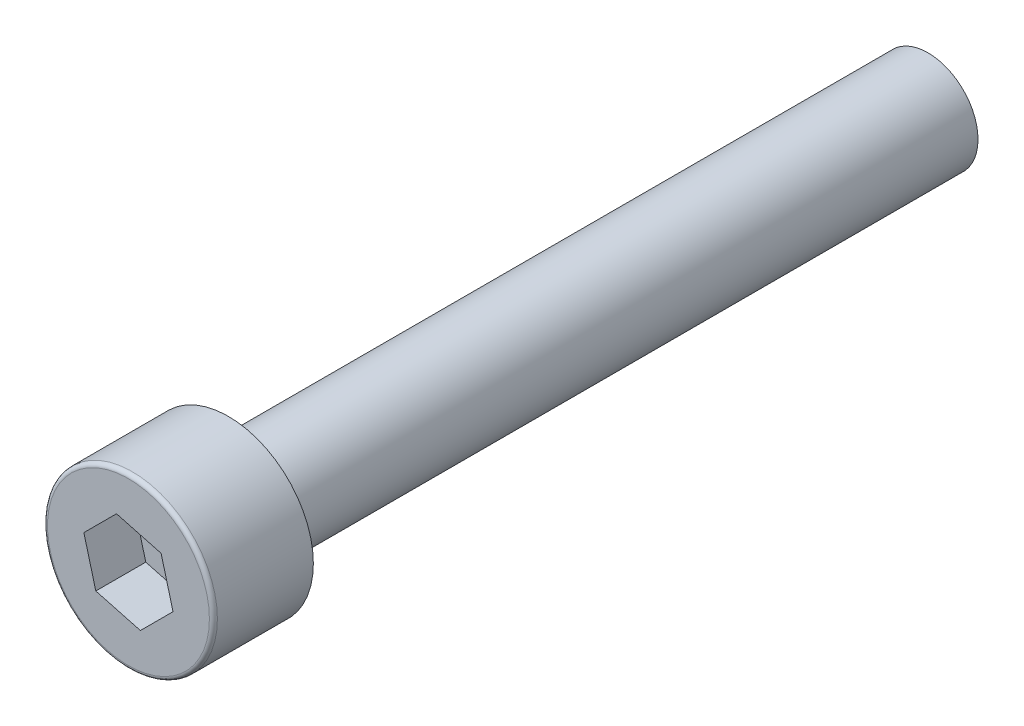
ISO-10303-21;
HEADER;
FILE_DESCRIPTION(('STEP AP214'),'2;1');
FILE_NAME('part.step','',(''),(''),'','','');
FILE_SCHEMA(('AUTOMOTIVE_DESIGN { 1 0 10303 214 1 1 1 1 }'));
ENDSEC;
DATA;
#1=APPLICATION_CONTEXT('core data for automotive mechanical design processes');
#2=APPLICATION_PROTOCOL_DEFINITION('international standard','automotive_design',2000,#1);
#3=PRODUCT_CONTEXT('',#1,'mechanical');
#4=PRODUCT('Part','Part','',(#3));
#5=PRODUCT_RELATED_PRODUCT_CATEGORY('part','',(#4));
#6=PRODUCT_DEFINITION_FORMATION('','',#4);
#7=PRODUCT_DEFINITION_CONTEXT('part definition',#1,'design');
#8=PRODUCT_DEFINITION('design','',#6,#7);
#9=PRODUCT_DEFINITION_SHAPE('','',#8);
#10=(LENGTH_UNIT() NAMED_UNIT(*) SI_UNIT(.MILLI.,.METRE.));
#11=(NAMED_UNIT(*) PLANE_ANGLE_UNIT() SI_UNIT($,.RADIAN.));
#12=(NAMED_UNIT(*) SI_UNIT($,.STERADIAN.) SOLID_ANGLE_UNIT());
#13=UNCERTAINTY_MEASURE_WITH_UNIT(LENGTH_MEASURE(1.E-05),#10,'distance_accuracy_value','');
#14=(GEOMETRIC_REPRESENTATION_CONTEXT(3) GLOBAL_UNCERTAINTY_ASSIGNED_CONTEXT((#13)) GLOBAL_UNIT_ASSIGNED_CONTEXT((#10,
#11,#12)) REPRESENTATION_CONTEXT('',''));
#15=CARTESIAN_POINT('',(0.,0.,0.));
#16=DIRECTION('',(0.,0.,1.));
#17=DIRECTION('',(1.,0.,0.));
#18=AXIS2_PLACEMENT_3D('',#15,#16,#17);
#19=CARTESIAN_POINT('',(0.,0.,0.));
#20=DIRECTION('',(0.,0.,1.));
#21=DIRECTION('',(1.,0.,0.));
#22=AXIS2_PLACEMENT_3D('',#19,#20,#21);
#23=PLANE('',#22);
#24=CARTESIAN_POINT('',(0.,0.,0.));
#25=DIRECTION('',(0.,0.,1.));
#26=DIRECTION('',(1.,0.,0.));
#27=AXIS2_PLACEMENT_3D('',#24,#25,#26);
#28=CIRCLE('',#27,4.25);
#29=CARTESIAN_POINT('',(4.25,0.,0.));
#30=VERTEX_POINT('',#29);
#31=EDGE_CURVE('E137',#30,#30,#28,.T.);
#32=ORIENTED_EDGE('',*,*,#31,.F.);
#33=EDGE_LOOP('',(#32));
#34=FACE_BOUND('',#33,.T.);
#35=CARTESIAN_POINT('',(0.,0.,0.));
#36=DIRECTION('',(0.,0.,1.));
#37=DIRECTION('',(1.,0.,0.));
#38=AXIS2_PLACEMENT_3D('',#35,#36,#37);
#39=CIRCLE('',#38,2.5);
#40=CARTESIAN_POINT('',(2.5,0.,0.));
#41=VERTEX_POINT('',#40);
#42=EDGE_CURVE('E145',#41,#41,#39,.F.);
#43=ORIENTED_EDGE('',*,*,#42,.F.);
#44=EDGE_LOOP('',(#43));
#45=FACE_BOUND('',#44,.T.);
#46=ADVANCED_FACE('F34',(#34,#45),#23,.F.);
#47=CARTESIAN_POINT('',(0.,0.,5.));
#48=DIRECTION('',(0.,0.,-1.));
#49=DIRECTION('',(-1.,0.,0.));
#50=AXIS2_PLACEMENT_3D('',#47,#48,#49);
#51=CYLINDRICAL_SURFACE('',#50,4.25);
#52=CARTESIAN_POINT('',(0.,0.,4.8));
#53=DIRECTION('',(0.,0.,1.));
#54=DIRECTION('',(1.,0.,0.));
#55=AXIS2_PLACEMENT_3D('',#52,#53,#54);
#56=CIRCLE('',#55,4.25);
#57=CARTESIAN_POINT('',(4.25,0.,4.8));
#58=VERTEX_POINT('',#57);
#59=EDGE_CURVE('E11',#58,#58,#56,.F.);
#60=ORIENTED_EDGE('',*,*,#59,.T.);
#61=EDGE_LOOP('',(#60));
#62=FACE_BOUND('',#61,.T.);
#63=ORIENTED_EDGE('',*,*,#31,.T.);
#64=EDGE_LOOP('',(#63));
#65=FACE_BOUND('',#64,.T.);
#66=ADVANCED_FACE('F164',(#62,#65),#51,.T.);
#67=CARTESIAN_POINT('',(0.,0.,5.));
#68=DIRECTION('',(0.,0.,1.));
#69=DIRECTION('',(1.,0.,0.));
#70=AXIS2_PLACEMENT_3D('',#67,#68,#69);
#71=PLANE('',#70);
#72=CARTESIAN_POINT('',(0.,0.,5.));
#73=DIRECTION('',(0.,0.,1.));
#74=DIRECTION('',(1.,0.,0.));
#75=AXIS2_PLACEMENT_3D('',#72,#73,#74);
#76=CIRCLE('',#75,4.05);
#77=CARTESIAN_POINT('',(4.05,0.,5.));
#78=VERTEX_POINT('',#77);
#79=EDGE_CURVE('E42',#78,#78,#76,.T.);
#80=ORIENTED_EDGE('',*,*,#79,.T.);
#81=EDGE_LOOP('',(#80));
#82=FACE_BOUND('',#81,.T.);
#83=DIRECTION('',(0.258819045102521,-0.965925826289068,0.));
#84=VECTOR('',#83,1.);
#85=CARTESIAN_POINT('',(-2.23071014330082,0.597716981445369,5.));
#86=LINE('',#85,#84);
#87=CARTESIAN_POINT('',(-2.23071014330082,0.597716981445369,5.));
#88=VERTEX_POINT('',#87);
#89=CARTESIAN_POINT('',(-1.63299316185545,-1.63299316185545,5.));
#90=VERTEX_POINT('',#89);
#91=EDGE_CURVE('E49',#88,#90,#86,.T.);
#92=ORIENTED_EDGE('',*,*,#91,.F.);
#93=DIRECTION('',(-0.707106781186547,-0.707106781186548,0.));
#94=VECTOR('',#93,1.);
#95=CARTESIAN_POINT('',(-0.597716981445369,2.23071014330082,5.));
#96=LINE('',#95,#94);
#97=CARTESIAN_POINT('',(-0.597716981445369,2.23071014330082,5.));
#98=VERTEX_POINT('',#97);
#99=EDGE_CURVE('E133',#98,#88,#96,.T.);
#100=ORIENTED_EDGE('',*,*,#99,.F.);
#101=DIRECTION('',(-0.965925826289068,0.258819045102521,0.));
#102=VECTOR('',#101,1.);
#103=CARTESIAN_POINT('',(1.63299316185545,1.63299316185545,5.));
#104=LINE('',#103,#102);
#105=CARTESIAN_POINT('',(1.63299316185545,1.63299316185545,5.));
#106=VERTEX_POINT('',#105);
#107=EDGE_CURVE('E131',#106,#98,#104,.T.);
#108=ORIENTED_EDGE('',*,*,#107,.F.);
#109=DIRECTION('',(-0.258819045102521,0.965925826289068,0.));
#110=VECTOR('',#109,1.);
#111=CARTESIAN_POINT('',(2.23071014330082,-0.597716981445369,5.));
#112=LINE('',#111,#110);
#113=CARTESIAN_POINT('',(2.23071014330082,-0.597716981445369,5.));
#114=VERTEX_POINT('',#113);
#115=EDGE_CURVE('E97',#114,#106,#112,.T.);
#116=ORIENTED_EDGE('',*,*,#115,.F.);
#117=DIRECTION('',(0.707106781186547,0.707106781186547,0.));
#118=VECTOR('',#117,1.);
#119=CARTESIAN_POINT('',(0.597716981445369,-2.23071014330082,5.));
#120=LINE('',#119,#118);
#121=CARTESIAN_POINT('',(0.597716981445369,-2.23071014330082,5.));
#122=VERTEX_POINT('',#121);
#123=EDGE_CURVE('E127',#122,#114,#120,.T.);
#124=ORIENTED_EDGE('',*,*,#123,.F.);
#125=DIRECTION('',(0.965925826289068,-0.258819045102521,0.));
#126=VECTOR('',#125,1.);
#127=CARTESIAN_POINT('',(-1.63299316185545,-1.63299316185545,5.));
#128=LINE('',#127,#126);
#129=EDGE_CURVE('E123',#90,#122,#128,.T.);
#130=ORIENTED_EDGE('',*,*,#129,.F.);
#131=EDGE_LOOP('',(#92,#100,#108,#116,#124,#130));
#132=FACE_BOUND('',#131,.T.);
#133=ADVANCED_FACE('F150',(#82,#132),#71,.T.);
#134=CARTESIAN_POINT('',(-2.23071014330082,0.597716981445369,2.5));
#135=DIRECTION('',(-0.965925826289068,-0.258819045102521,0.));
#136=DIRECTION('',(0.258819045102521,-0.965925826289068,0.));
#137=AXIS2_PLACEMENT_3D('',#134,#135,#136);
#138=PLANE('',#137);
#139=ORIENTED_EDGE('',*,*,#91,.T.);
#140=DIRECTION('',(0.,0.,1.));
#141=VECTOR('',#140,1.);
#142=CARTESIAN_POINT('',(-1.63299316185545,-1.63299316185545,2.5));
#143=LINE('',#142,#141);
#144=CARTESIAN_POINT('',(-1.63299316185545,-1.63299316185545,2.5));
#145=VERTEX_POINT('',#144);
#146=EDGE_CURVE('E79',#145,#90,#143,.T.);
#147=ORIENTED_EDGE('',*,*,#146,.F.);
#148=DIRECTION('',(0.258819045102521,-0.965925826289068,0.));
#149=VECTOR('',#148,1.);
#150=CARTESIAN_POINT('',(-2.23071014330082,0.597716981445369,2.5));
#151=LINE('',#150,#149);
#152=CARTESIAN_POINT('',(-2.23071014330082,0.597716981445369,2.5));
#153=VERTEX_POINT('',#152);
#154=EDGE_CURVE('E135',#153,#145,#151,.T.);
#155=ORIENTED_EDGE('',*,*,#154,.F.);
#156=DIRECTION('',(0.,0.,1.));
#157=VECTOR('',#156,1.);
#158=CARTESIAN_POINT('',(-2.23071014330082,0.597716981445369,2.5));
#159=LINE('',#158,#157);
#160=EDGE_CURVE('E57',#153,#88,#159,.T.);
#161=ORIENTED_EDGE('',*,*,#160,.T.);
#162=EDGE_LOOP('',(#139,#147,#155,#161));
#163=FACE_BOUND('',#162,.T.);
#164=ADVANCED_FACE('F176',(#163),#138,.F.);
#165=CARTESIAN_POINT('',(-0.597716981445369,2.23071014330082,2.5));
#166=DIRECTION('',(-0.707106781186548,0.707106781186547,0.));
#167=DIRECTION('',(-0.707106781186547,-0.707106781186548,0.));
#168=AXIS2_PLACEMENT_3D('',#165,#166,#167);
#169=PLANE('',#168);
#170=ORIENTED_EDGE('',*,*,#99,.T.);
#171=ORIENTED_EDGE('',*,*,#160,.F.);
#172=DIRECTION('',(-0.707106781186547,-0.707106781186548,0.));
#173=VECTOR('',#172,1.);
#174=CARTESIAN_POINT('',(-0.597716981445369,2.23071014330082,2.5));
#175=LINE('',#174,#173);
#176=CARTESIAN_POINT('',(-0.597716981445369,2.23071014330082,2.5));
#177=VERTEX_POINT('',#176);
#178=EDGE_CURVE('E109',#177,#153,#175,.T.);
#179=ORIENTED_EDGE('',*,*,#178,.F.);
#180=DIRECTION('',(0.,0.,1.));
#181=VECTOR('',#180,1.);
#182=CARTESIAN_POINT('',(-0.597716981445369,2.23071014330082,2.5));
#183=LINE('',#182,#181);
#184=EDGE_CURVE('E101',#177,#98,#183,.T.);
#185=ORIENTED_EDGE('',*,*,#184,.T.);
#186=EDGE_LOOP('',(#170,#171,#179,#185));
#187=FACE_BOUND('',#186,.T.);
#188=ADVANCED_FACE('F179',(#187),#169,.F.);
#189=CARTESIAN_POINT('',(1.63299316185545,1.63299316185545,2.5));
#190=DIRECTION('',(0.258819045102521,0.965925826289068,0.));
#191=DIRECTION('',(-0.965925826289068,0.258819045102521,0.));
#192=AXIS2_PLACEMENT_3D('',#189,#190,#191);
#193=PLANE('',#192);
#194=ORIENTED_EDGE('',*,*,#107,.T.);
#195=ORIENTED_EDGE('',*,*,#184,.F.);
#196=DIRECTION('',(-0.965925826289068,0.258819045102521,0.));
#197=VECTOR('',#196,1.);
#198=CARTESIAN_POINT('',(1.63299316185545,1.63299316185545,2.5));
#199=LINE('',#198,#197);
#200=CARTESIAN_POINT('',(1.63299316185545,1.63299316185545,2.5));
#201=VERTEX_POINT('',#200);
#202=EDGE_CURVE('E105',#201,#177,#199,.T.);
#203=ORIENTED_EDGE('',*,*,#202,.F.);
#204=DIRECTION('',(0.,0.,1.));
#205=VECTOR('',#204,1.);
#206=CARTESIAN_POINT('',(1.63299316185545,1.63299316185545,2.5));
#207=LINE('',#206,#205);
#208=EDGE_CURVE('E90',#201,#106,#207,.T.);
#209=ORIENTED_EDGE('',*,*,#208,.T.);
#210=EDGE_LOOP('',(#194,#195,#203,#209));
#211=FACE_BOUND('',#210,.T.);
#212=ADVANCED_FACE('F106',(#211),#193,.F.);
#213=CARTESIAN_POINT('',(2.23071014330082,-0.597716981445369,2.5));
#214=DIRECTION('',(0.965925826289068,0.258819045102521,0.));
#215=DIRECTION('',(-0.258819045102521,0.965925826289068,0.));
#216=AXIS2_PLACEMENT_3D('',#213,#214,#215);
#217=PLANE('',#216);
#218=ORIENTED_EDGE('',*,*,#115,.T.);
#219=ORIENTED_EDGE('',*,*,#208,.F.);
#220=DIRECTION('',(-0.258819045102521,0.965925826289068,0.));
#221=VECTOR('',#220,1.);
#222=CARTESIAN_POINT('',(2.23071014330082,-0.597716981445369,2.5));
#223=LINE('',#222,#221);
#224=CARTESIAN_POINT('',(2.23071014330082,-0.597716981445369,2.5));
#225=VERTEX_POINT('',#224);
#226=EDGE_CURVE('E94',#225,#201,#223,.T.);
#227=ORIENTED_EDGE('',*,*,#226,.F.);
#228=DIRECTION('',(0.,0.,1.));
#229=VECTOR('',#228,1.);
#230=CARTESIAN_POINT('',(2.23071014330082,-0.597716981445369,2.5));
#231=LINE('',#230,#229);
#232=EDGE_CURVE('E102',#225,#114,#231,.T.);
#233=ORIENTED_EDGE('',*,*,#232,.T.);
#234=EDGE_LOOP('',(#218,#219,#227,#233));
#235=FACE_BOUND('',#234,.T.);
#236=ADVANCED_FACE('F92',(#235),#217,.F.);
#237=CARTESIAN_POINT('',(0.597716981445369,-2.23071014330082,2.5));
#238=DIRECTION('',(0.707106781186548,-0.707106781186548,0.));
#239=DIRECTION('',(0.707106781186548,0.707106781186548,0.));
#240=AXIS2_PLACEMENT_3D('',#237,#238,#239);
#241=PLANE('',#240);
#242=ORIENTED_EDGE('',*,*,#123,.T.);
#243=ORIENTED_EDGE('',*,*,#232,.F.);
#244=DIRECTION('',(0.707106781186547,0.707106781186547,0.));
#245=VECTOR('',#244,1.);
#246=CARTESIAN_POINT('',(0.597716981445369,-2.23071014330082,2.5));
#247=LINE('',#246,#245);
#248=CARTESIAN_POINT('',(0.597716981445369,-2.23071014330082,2.5));
#249=VERTEX_POINT('',#248);
#250=EDGE_CURVE('E115',#249,#225,#247,.T.);
#251=ORIENTED_EDGE('',*,*,#250,.F.);
#252=DIRECTION('',(0.,0.,1.));
#253=VECTOR('',#252,1.);
#254=CARTESIAN_POINT('',(0.597716981445369,-2.23071014330082,2.5));
#255=LINE('',#254,#253);
#256=EDGE_CURVE('E140',#249,#122,#255,.T.);
#257=ORIENTED_EDGE('',*,*,#256,.T.);
#258=EDGE_LOOP('',(#242,#243,#251,#257));
#259=FACE_BOUND('',#258,.T.);
#260=ADVANCED_FACE('F183',(#259),#241,.F.);
#261=CARTESIAN_POINT('',(-1.63299316185545,-1.63299316185545,2.5));
#262=DIRECTION('',(-0.258819045102521,-0.965925826289068,0.));
#263=DIRECTION('',(0.965925826289068,-0.258819045102521,0.));
#264=AXIS2_PLACEMENT_3D('',#261,#262,#263);
#265=PLANE('',#264);
#266=ORIENTED_EDGE('',*,*,#129,.T.);
#267=ORIENTED_EDGE('',*,*,#256,.F.);
#268=DIRECTION('',(0.965925826289068,-0.258819045102521,0.));
#269=VECTOR('',#268,1.);
#270=CARTESIAN_POINT('',(-1.63299316185545,-1.63299316185545,2.5));
#271=LINE('',#270,#269);
#272=EDGE_CURVE('E117',#145,#249,#271,.T.);
#273=ORIENTED_EDGE('',*,*,#272,.F.);
#274=ORIENTED_EDGE('',*,*,#146,.T.);
#275=EDGE_LOOP('',(#266,#267,#273,#274));
#276=FACE_BOUND('',#275,.T.);
#277=ADVANCED_FACE('F180',(#276),#265,.F.);
#278=CARTESIAN_POINT('',(0.,0.,2.5));
#279=DIRECTION('',(0.,0.,1.));
#280=DIRECTION('',(1.,0.,0.));
#281=AXIS2_PLACEMENT_3D('',#278,#279,#280);
#282=PLANE('',#281);
#283=ORIENTED_EDGE('',*,*,#154,.T.);
#284=ORIENTED_EDGE('',*,*,#272,.T.);
#285=ORIENTED_EDGE('',*,*,#250,.T.);
#286=ORIENTED_EDGE('',*,*,#226,.T.);
#287=ORIENTED_EDGE('',*,*,#202,.T.);
#288=ORIENTED_EDGE('',*,*,#178,.T.);
#289=EDGE_LOOP('',(#283,#284,#285,#286,#287,#288));
#290=FACE_BOUND('',#289,.T.);
#291=ADVANCED_FACE('F112',(#290),#282,.T.);
#292=CARTESIAN_POINT('',(0.,0.,-35.));
#293=DIRECTION('',(0.,0.,1.));
#294=DIRECTION('',(1.,0.,0.));
#295=AXIS2_PLACEMENT_3D('',#292,#293,#294);
#296=CYLINDRICAL_SURFACE('',#295,2.5);
#297=CARTESIAN_POINT('',(0.,0.,-35.));
#298=DIRECTION('',(0.,0.,-1.));
#299=DIRECTION('',(-1.,0.,0.));
#300=AXIS2_PLACEMENT_3D('',#297,#298,#299);
#301=CIRCLE('',#300,2.5);
#302=CARTESIAN_POINT('',(-2.5,0.,-35.));
#303=VERTEX_POINT('',#302);
#304=EDGE_CURVE('E124',#303,#303,#301,.T.);
#305=ORIENTED_EDGE('',*,*,#304,.F.);
#306=EDGE_LOOP('',(#305));
#307=FACE_BOUND('',#306,.T.);
#308=ORIENTED_EDGE('',*,*,#42,.T.);
#309=EDGE_LOOP('',(#308));
#310=FACE_BOUND('',#309,.T.);
#311=ADVANCED_FACE('F159',(#307,#310),#296,.T.);
#312=CARTESIAN_POINT('',(0.,0.,-35.));
#313=DIRECTION('',(0.,0.,-1.));
#314=DIRECTION('',(-1.,0.,0.));
#315=AXIS2_PLACEMENT_3D('',#312,#313,#314);
#316=PLANE('',#315);
#317=ORIENTED_EDGE('',*,*,#304,.T.);
#318=EDGE_LOOP('',(#317));
#319=FACE_BOUND('',#318,.T.);
#320=ADVANCED_FACE('F154',(#319),#316,.T.);
#321=CARTESIAN_POINT('',(0.,0.,4.8));
#322=DIRECTION('',(0.,0.,1.));
#323=DIRECTION('',(1.,0.,0.));
#324=AXIS2_PLACEMENT_3D('',#321,#322,#323);
#325=TOROIDAL_SURFACE('',#324,4.05,0.2);
#326=ORIENTED_EDGE('',*,*,#59,.F.);
#327=EDGE_LOOP('',(#326));
#328=FACE_BOUND('',#327,.T.);
#329=ORIENTED_EDGE('',*,*,#79,.F.);
#330=EDGE_LOOP('',(#329));
#331=FACE_BOUND('',#330,.T.);
#332=ADVANCED_FACE('F36',(#328,#331),#325,.T.);
#333=CLOSED_SHELL('',(#46,#66,#133,#164,#188,#212,#236,#260,#277,#291,#311,#320,#332));
#334=MANIFOLD_SOLID_BREP('B2',#333);
#335=ADVANCED_BREP_SHAPE_REPRESENTATION('',(#18,#334),#14);
#336=SHAPE_DEFINITION_REPRESENTATION(#9,#335);
ENDSEC;
END-ISO-10303-21;
